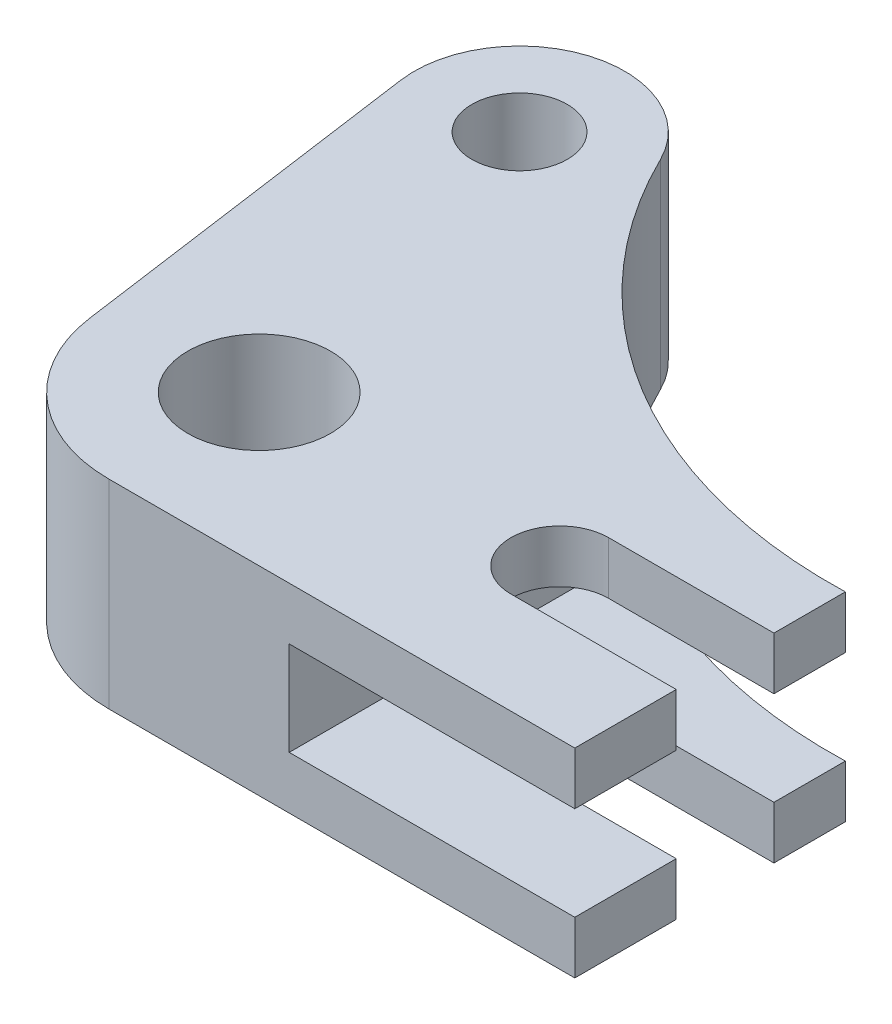
ISO-10303-21;
HEADER;
FILE_DESCRIPTION(('STEP AP214'),'2;1');
FILE_NAME('part.step','',(''),(''),'','','');
FILE_SCHEMA(('AUTOMOTIVE_DESIGN { 1 0 10303 214 1 1 1 1 }'));
ENDSEC;
DATA;
#1=APPLICATION_CONTEXT('core data for automotive mechanical design processes');
#2=APPLICATION_PROTOCOL_DEFINITION('international standard','automotive_design',2000,#1);
#3=PRODUCT_CONTEXT('',#1,'mechanical');
#4=PRODUCT('Part','Part','',(#3));
#5=PRODUCT_RELATED_PRODUCT_CATEGORY('part','',(#4));
#6=PRODUCT_DEFINITION_FORMATION('','',#4);
#7=PRODUCT_DEFINITION_CONTEXT('part definition',#1,'design');
#8=PRODUCT_DEFINITION('design','',#6,#7);
#9=PRODUCT_DEFINITION_SHAPE('','',#8);
#10=(LENGTH_UNIT() NAMED_UNIT(*) SI_UNIT(.MILLI.,.METRE.));
#11=(NAMED_UNIT(*) PLANE_ANGLE_UNIT() SI_UNIT($,.RADIAN.));
#12=(NAMED_UNIT(*) SI_UNIT($,.STERADIAN.) SOLID_ANGLE_UNIT());
#13=UNCERTAINTY_MEASURE_WITH_UNIT(LENGTH_MEASURE(1.E-05),#10,'distance_accuracy_value','');
#14=(GEOMETRIC_REPRESENTATION_CONTEXT(3) GLOBAL_UNCERTAINTY_ASSIGNED_CONTEXT((#13)) GLOBAL_UNIT_ASSIGNED_CONTEXT((#10,
#11,#12)) REPRESENTATION_CONTEXT('',''));
#15=CARTESIAN_POINT('',(0.,0.,0.));
#16=DIRECTION('',(0.,0.,1.));
#17=DIRECTION('',(1.,0.,0.));
#18=AXIS2_PLACEMENT_3D('',#15,#16,#17);
#19=CARTESIAN_POINT('',(-1.94499816987299,13.25,-102.971762572887));
#20=DIRECTION('',(0.,-1.,0.));
#21=DIRECTION('',(0.,0.,-1.));
#22=AXIS2_PLACEMENT_3D('',#19,#20,#21);
#23=CYLINDRICAL_SURFACE('',#22,67.);
#24=DIRECTION('',(0.,-1.,0.));
#25=VECTOR('',#24,1.);
#26=CARTESIAN_POINT('',(0.,13.25,-36.));
#27=LINE('',#26,#25);
#28=CARTESIAN_POINT('',(0.,13.25,-36.));
#29=VERTEX_POINT('',#28);
#30=CARTESIAN_POINT('',(0.,6.25,-36.));
#31=VERTEX_POINT('',#30);
#32=EDGE_CURVE('E233',#29,#31,#27,.T.);
#33=ORIENTED_EDGE('',*,*,#32,.T.);
#34=CARTESIAN_POINT('',(-1.94499816987299,6.25,-102.971762572887));
#35=DIRECTION('',(0.,-1.,0.));
#36=DIRECTION('',(0.,0.,-1.));
#37=AXIS2_PLACEMENT_3D('',#34,#35,#36);
#38=CIRCLE('',#37,67.);
#39=CARTESIAN_POINT('',(-38.,6.25,-46.50020474924));
#40=VERTEX_POINT('',#39);
#41=EDGE_CURVE('E423',#31,#40,#38,.T.);
#42=ORIENTED_EDGE('',*,*,#41,.T.);
#43=DIRECTION('',(0.,-1.,0.));
#44=VECTOR('',#43,1.);
#45=CARTESIAN_POINT('',(-38.,13.25,-46.50020474924));
#46=LINE('',#45,#44);
#47=CARTESIAN_POINT('',(-38.,-6.25,-46.50020474924));
#48=VERTEX_POINT('',#47);
#49=EDGE_CURVE('E191',#48,#40,#46,.F.);
#50=ORIENTED_EDGE('',*,*,#49,.F.);
#51=CARTESIAN_POINT('',(-1.94499816987299,-6.25,-102.971762572887));
#52=DIRECTION('',(0.,1.,0.));
#53=DIRECTION('',(0.,0.,1.));
#54=AXIS2_PLACEMENT_3D('',#51,#52,#53);
#55=CIRCLE('',#54,67.);
#56=CARTESIAN_POINT('',(0.,-6.25,-36.));
#57=VERTEX_POINT('',#56);
#58=EDGE_CURVE('E271',#48,#57,#55,.T.);
#59=ORIENTED_EDGE('',*,*,#58,.T.);
#60=CARTESIAN_POINT('',(0.,-13.25,-36.));
#61=VERTEX_POINT('',#60);
#62=EDGE_CURVE('E110',#57,#61,#27,.T.);
#63=ORIENTED_EDGE('',*,*,#62,.T.);
#64=CARTESIAN_POINT('',(-1.94499816987299,-13.25,-102.971762572887));
#65=DIRECTION('',(0.,1.,0.));
#66=DIRECTION('',(0.,0.,1.));
#67=AXIS2_PLACEMENT_3D('',#64,#65,#66);
#68=CIRCLE('',#67,67.);
#69=CARTESIAN_POINT('',(-62.1102827092568,-13.25,-73.4906069595979));
#70=VERTEX_POINT('',#69);
#71=EDGE_CURVE('E186',#70,#61,#68,.T.);
#72=ORIENTED_EDGE('',*,*,#71,.F.);
#73=DIRECTION('',(0.,-1.,0.));
#74=VECTOR('',#73,1.);
#75=CARTESIAN_POINT('',(-62.1102827092568,13.25,-73.4906069595979));
#76=LINE('',#75,#74);
#77=CARTESIAN_POINT('',(-62.1102827092568,13.25,-73.4906069595979));
#78=VERTEX_POINT('',#77);
#79=EDGE_CURVE('E116',#78,#70,#76,.T.);
#80=ORIENTED_EDGE('',*,*,#79,.F.);
#81=CARTESIAN_POINT('',(-1.94499816987299,13.25,-102.971762572887));
#82=DIRECTION('',(0.,1.,0.));
#83=DIRECTION('',(0.,0.,1.));
#84=AXIS2_PLACEMENT_3D('',#81,#82,#83);
#85=CIRCLE('',#84,67.);
#86=EDGE_CURVE('E232',#78,#29,#85,.T.);
#87=ORIENTED_EDGE('',*,*,#86,.T.);
#88=EDGE_LOOP('',(#33,#42,#50,#59,#63,#72,#80,#87));
#89=FACE_BOUND('',#88,.T.);
#90=ADVANCED_FACE('F46',(#89),#23,.F.);
#91=CARTESIAN_POINT('',(0.,13.25,0.));
#92=DIRECTION('',(0.,0.,1.));
#93=DIRECTION('',(1.,0.,0.));
#94=AXIS2_PLACEMENT_3D('',#91,#92,#93);
#95=PLANE('',#94);
#96=DIRECTION('',(0.,1.,0.));
#97=VECTOR('',#96,1.);
#98=CARTESIAN_POINT('',(-38.,-6.25,0.));
#99=LINE('',#98,#97);
#100=CARTESIAN_POINT('',(-38.,-6.25,0.));
#101=VERTEX_POINT('',#100);
#102=CARTESIAN_POINT('',(-38.,6.25,0.));
#103=VERTEX_POINT('',#102);
#104=EDGE_CURVE('E388',#101,#103,#99,.T.);
#105=ORIENTED_EDGE('',*,*,#104,.T.);
#106=DIRECTION('',(1.,0.,0.));
#107=VECTOR('',#106,1.);
#108=CARTESIAN_POINT('',(-38.,6.25,0.));
#109=LINE('',#108,#107);
#110=CARTESIAN_POINT('',(0.,6.25,0.));
#111=VERTEX_POINT('',#110);
#112=EDGE_CURVE('E393',#103,#111,#109,.T.);
#113=ORIENTED_EDGE('',*,*,#112,.T.);
#114=DIRECTION('',(0.,-1.,0.));
#115=VECTOR('',#114,1.);
#116=CARTESIAN_POINT('',(0.,13.25,0.));
#117=LINE('',#116,#115);
#118=CARTESIAN_POINT('',(0.,13.25,0.));
#119=VERTEX_POINT('',#118);
#120=EDGE_CURVE('E249',#119,#111,#117,.T.);
#121=ORIENTED_EDGE('',*,*,#120,.F.);
#122=DIRECTION('',(-1.,0.,0.));
#123=VECTOR('',#122,1.);
#124=CARTESIAN_POINT('',(0.,13.25,0.));
#125=LINE('',#124,#123);
#126=CARTESIAN_POINT('',(-62.,13.25,0.));
#127=VERTEX_POINT('',#126);
#128=EDGE_CURVE('E315',#119,#127,#125,.T.);
#129=ORIENTED_EDGE('',*,*,#128,.T.);
#130=DIRECTION('',(0.,-1.,0.));
#131=VECTOR('',#130,1.);
#132=CARTESIAN_POINT('',(-62.,13.25,0.));
#133=LINE('',#132,#131);
#134=CARTESIAN_POINT('',(-62.,-13.25,0.));
#135=VERTEX_POINT('',#134);
#136=EDGE_CURVE('E253',#127,#135,#133,.T.);
#137=ORIENTED_EDGE('',*,*,#136,.T.);
#138=DIRECTION('',(-1.,0.,0.));
#139=VECTOR('',#138,1.);
#140=CARTESIAN_POINT('',(0.,-13.25,0.));
#141=LINE('',#140,#139);
#142=CARTESIAN_POINT('',(0.,-13.25,0.));
#143=VERTEX_POINT('',#142);
#144=EDGE_CURVE('E201',#143,#135,#141,.T.);
#145=ORIENTED_EDGE('',*,*,#144,.F.);
#146=CARTESIAN_POINT('',(0.,-6.25,0.));
#147=VERTEX_POINT('',#146);
#148=EDGE_CURVE('E248',#147,#143,#117,.T.);
#149=ORIENTED_EDGE('',*,*,#148,.F.);
#150=DIRECTION('',(1.,0.,0.));
#151=VECTOR('',#150,1.);
#152=CARTESIAN_POINT('',(-38.,-6.25,0.));
#153=LINE('',#152,#151);
#154=EDGE_CURVE('E396',#101,#147,#153,.T.);
#155=ORIENTED_EDGE('',*,*,#154,.F.);
#156=EDGE_LOOP('',(#105,#113,#121,#129,#137,#145,#149,#155));
#157=FACE_BOUND('',#156,.T.);
#158=ADVANCED_FACE('F311',(#157),#95,.T.);
#159=CARTESIAN_POINT('',(0.,13.25,0.));
#160=DIRECTION('',(-1.,0.,0.));
#161=DIRECTION('',(0.,0.,1.));
#162=AXIS2_PLACEMENT_3D('',#159,#160,#161);
#163=PLANE('',#162);
#164=DIRECTION('',(0.,0.,-1.));
#165=VECTOR('',#164,1.);
#166=CARTESIAN_POINT('',(0.,6.25,0.));
#167=LINE('',#166,#165);
#168=CARTESIAN_POINT('',(0.,6.25,-13.5));
#169=VERTEX_POINT('',#168);
#170=EDGE_CURVE('E351',#111,#169,#167,.T.);
#171=ORIENTED_EDGE('',*,*,#170,.T.);
#172=DIRECTION('',(0.,-1.,0.));
#173=VECTOR('',#172,1.);
#174=CARTESIAN_POINT('',(0.,13.25,-13.5));
#175=LINE('',#174,#173);
#176=CARTESIAN_POINT('',(0.,13.25,-13.5));
#177=VERTEX_POINT('',#176);
#178=EDGE_CURVE('E244',#177,#169,#175,.T.);
#179=ORIENTED_EDGE('',*,*,#178,.F.);
#180=DIRECTION('',(0.,0.,-1.));
#181=VECTOR('',#180,1.);
#182=CARTESIAN_POINT('',(0.,13.25,0.));
#183=LINE('',#182,#181);
#184=EDGE_CURVE('E172',#119,#177,#183,.T.);
#185=ORIENTED_EDGE('',*,*,#184,.F.);
#186=ORIENTED_EDGE('',*,*,#120,.T.);
#187=EDGE_LOOP('',(#171,#179,#185,#186));
#188=FACE_BOUND('',#187,.T.);
#189=ADVANCED_FACE('F348',(#188),#163,.F.);
#190=DIRECTION('',(0.,0.,1.));
#191=VECTOR('',#190,1.);
#192=CARTESIAN_POINT('',(0.,-6.25,-73.3389449580955));
#193=LINE('',#192,#191);
#194=CARTESIAN_POINT('',(0.,-6.25,-13.5));
#195=VERTEX_POINT('',#194);
#196=EDGE_CURVE('E301',#195,#147,#193,.T.);
#197=ORIENTED_EDGE('',*,*,#196,.T.);
#198=ORIENTED_EDGE('',*,*,#148,.T.);
#199=DIRECTION('',(0.,0.,-1.));
#200=VECTOR('',#199,1.);
#201=CARTESIAN_POINT('',(0.,-13.25,0.));
#202=LINE('',#201,#200);
#203=CARTESIAN_POINT('',(0.,-13.25,-13.5));
#204=VERTEX_POINT('',#203);
#205=EDGE_CURVE('E205',#143,#204,#202,.T.);
#206=ORIENTED_EDGE('',*,*,#205,.T.);
#207=EDGE_CURVE('E243',#195,#204,#175,.T.);
#208=ORIENTED_EDGE('',*,*,#207,.F.);
#209=EDGE_LOOP('',(#197,#198,#206,#208));
#210=FACE_BOUND('',#209,.T.);
#211=ADVANCED_FACE('F297',(#210),#163,.F.);
#212=CARTESIAN_POINT('',(0.,13.25,-13.5));
#213=DIRECTION('',(0.,0.,-1.));
#214=DIRECTION('',(-1.,0.,0.));
#215=AXIS2_PLACEMENT_3D('',#212,#213,#214);
#216=PLANE('',#215);
#217=ORIENTED_EDGE('',*,*,#178,.T.);
#218=DIRECTION('',(-1.,0.,0.));
#219=VECTOR('',#218,1.);
#220=CARTESIAN_POINT('',(0.,6.25,-13.5));
#221=LINE('',#220,#219);
#222=CARTESIAN_POINT('',(-22.,6.25,-13.5));
#223=VERTEX_POINT('',#222);
#224=EDGE_CURVE('E356',#169,#223,#221,.T.);
#225=ORIENTED_EDGE('',*,*,#224,.T.);
#226=DIRECTION('',(0.,-1.,0.));
#227=VECTOR('',#226,1.);
#228=CARTESIAN_POINT('',(-22.,13.25,-13.5));
#229=LINE('',#228,#227);
#230=CARTESIAN_POINT('',(-22.,13.25,-13.5));
#231=VERTEX_POINT('',#230);
#232=EDGE_CURVE('E240',#231,#223,#229,.T.);
#233=ORIENTED_EDGE('',*,*,#232,.F.);
#234=DIRECTION('',(1.,0.,0.));
#235=VECTOR('',#234,1.);
#236=CARTESIAN_POINT('',(0.,13.25,-13.5));
#237=LINE('',#236,#235);
#238=EDGE_CURVE('E168',#231,#177,#237,.T.);
#239=ORIENTED_EDGE('',*,*,#238,.T.);
#240=EDGE_LOOP('',(#217,#225,#233,#239));
#241=FACE_BOUND('',#240,.T.);
#242=ADVANCED_FACE('F354',(#241),#216,.T.);
#243=CARTESIAN_POINT('',(-22.,-6.25,-13.5));
#244=VERTEX_POINT('',#243);
#245=CARTESIAN_POINT('',(-22.,-13.25,-13.5));
#246=VERTEX_POINT('',#245);
#247=EDGE_CURVE('E154',#244,#246,#229,.T.);
#248=ORIENTED_EDGE('',*,*,#247,.F.);
#249=DIRECTION('',(1.,0.,0.));
#250=VECTOR('',#249,1.);
#251=CARTESIAN_POINT('',(0.,-6.25,-13.5));
#252=LINE('',#251,#250);
#253=EDGE_CURVE('E283',#244,#195,#252,.T.);
#254=ORIENTED_EDGE('',*,*,#253,.T.);
#255=ORIENTED_EDGE('',*,*,#207,.T.);
#256=DIRECTION('',(1.,0.,0.));
#257=VECTOR('',#256,1.);
#258=CARTESIAN_POINT('',(0.,-13.25,-13.5));
#259=LINE('',#258,#257);
#260=EDGE_CURVE('E209',#246,#204,#259,.T.);
#261=ORIENTED_EDGE('',*,*,#260,.F.);
#262=EDGE_LOOP('',(#248,#254,#255,#261));
#263=FACE_BOUND('',#262,.T.);
#264=ADVANCED_FACE('F536',(#263),#216,.T.);
#265=CARTESIAN_POINT('',(-22.,13.25,-20.));
#266=DIRECTION('',(0.,-1.,0.));
#267=DIRECTION('',(0.,0.,-1.));
#268=AXIS2_PLACEMENT_3D('',#265,#266,#267);
#269=CYLINDRICAL_SURFACE('',#268,6.5);
#270=ORIENTED_EDGE('',*,*,#232,.T.);
#271=CARTESIAN_POINT('',(-22.,6.25,-20.));
#272=DIRECTION('',(0.,-1.,0.));
#273=DIRECTION('',(0.,0.,-1.));
#274=AXIS2_PLACEMENT_3D('',#271,#272,#273);
#275=CIRCLE('',#274,6.5);
#276=CARTESIAN_POINT('',(-22.,6.25,-26.5));
#277=VERTEX_POINT('',#276);
#278=EDGE_CURVE('E150',#223,#277,#275,.T.);
#279=ORIENTED_EDGE('',*,*,#278,.T.);
#280=DIRECTION('',(0.,-1.,0.));
#281=VECTOR('',#280,1.);
#282=CARTESIAN_POINT('',(-22.,13.25,-26.5));
#283=LINE('',#282,#281);
#284=CARTESIAN_POINT('',(-22.,13.25,-26.5));
#285=VERTEX_POINT('',#284);
#286=EDGE_CURVE('E142',#285,#277,#283,.T.);
#287=ORIENTED_EDGE('',*,*,#286,.F.);
#288=CARTESIAN_POINT('',(-22.,13.25,-20.));
#289=DIRECTION('',(0.,1.,0.));
#290=DIRECTION('',(0.,0.,1.));
#291=AXIS2_PLACEMENT_3D('',#288,#289,#290);
#292=CIRCLE('',#291,6.5);
#293=EDGE_CURVE('E147',#285,#231,#292,.T.);
#294=ORIENTED_EDGE('',*,*,#293,.T.);
#295=EDGE_LOOP('',(#270,#279,#287,#294));
#296=FACE_BOUND('',#295,.T.);
#297=ADVANCED_FACE('F145',(#296),#269,.F.);
#298=CARTESIAN_POINT('',(-22.,-6.25,-26.5));
#299=VERTEX_POINT('',#298);
#300=CARTESIAN_POINT('',(-22.,-13.25,-26.5));
#301=VERTEX_POINT('',#300);
#302=EDGE_CURVE('E155',#299,#301,#283,.T.);
#303=ORIENTED_EDGE('',*,*,#302,.F.);
#304=CARTESIAN_POINT('',(-22.,-6.25,-20.));
#305=DIRECTION('',(0.,1.,0.));
#306=DIRECTION('',(0.,0.,1.));
#307=AXIS2_PLACEMENT_3D('',#304,#305,#306);
#308=CIRCLE('',#307,6.5);
#309=EDGE_CURVE('E411',#299,#244,#308,.T.);
#310=ORIENTED_EDGE('',*,*,#309,.T.);
#311=ORIENTED_EDGE('',*,*,#247,.T.);
#312=CARTESIAN_POINT('',(-22.,-13.25,-20.));
#313=DIRECTION('',(0.,1.,0.));
#314=DIRECTION('',(0.,0.,1.));
#315=AXIS2_PLACEMENT_3D('',#312,#313,#314);
#316=CIRCLE('',#315,6.5);
#317=EDGE_CURVE('E213',#301,#246,#316,.T.);
#318=ORIENTED_EDGE('',*,*,#317,.F.);
#319=EDGE_LOOP('',(#303,#310,#311,#318));
#320=FACE_BOUND('',#319,.T.);
#321=ADVANCED_FACE('F521',(#320),#269,.F.);
#322=CARTESIAN_POINT('',(0.,13.25,-26.5));
#323=DIRECTION('',(0.,0.,-1.));
#324=DIRECTION('',(-1.,0.,0.));
#325=AXIS2_PLACEMENT_3D('',#322,#323,#324);
#326=PLANE('',#325);
#327=DIRECTION('',(-1.,0.,0.));
#328=VECTOR('',#327,1.);
#329=CARTESIAN_POINT('',(0.,6.25,-26.5));
#330=LINE('',#329,#328);
#331=CARTESIAN_POINT('',(0.,6.25,-26.5));
#332=VERTEX_POINT('',#331);
#333=EDGE_CURVE('E282',#332,#277,#330,.T.);
#334=ORIENTED_EDGE('',*,*,#333,.F.);
#335=DIRECTION('',(0.,-1.,0.));
#336=VECTOR('',#335,1.);
#337=CARTESIAN_POINT('',(0.,13.25,-26.5));
#338=LINE('',#337,#336);
#339=CARTESIAN_POINT('',(0.,13.25,-26.5));
#340=VERTEX_POINT('',#339);
#341=EDGE_CURVE('E161',#340,#332,#338,.T.);
#342=ORIENTED_EDGE('',*,*,#341,.F.);
#343=DIRECTION('',(1.,0.,0.));
#344=VECTOR('',#343,1.);
#345=CARTESIAN_POINT('',(0.,13.25,-26.5));
#346=LINE('',#345,#344);
#347=EDGE_CURVE('E158',#285,#340,#346,.T.);
#348=ORIENTED_EDGE('',*,*,#347,.F.);
#349=ORIENTED_EDGE('',*,*,#286,.T.);
#350=EDGE_LOOP('',(#334,#342,#348,#349));
#351=FACE_BOUND('',#350,.T.);
#352=ADVANCED_FACE('F159',(#351),#326,.F.);
#353=DIRECTION('',(1.,0.,0.));
#354=VECTOR('',#353,1.);
#355=CARTESIAN_POINT('',(0.,-6.25,-26.5));
#356=LINE('',#355,#354);
#357=CARTESIAN_POINT('',(0.,-6.25,-26.5));
#358=VERTEX_POINT('',#357);
#359=EDGE_CURVE('E61',#299,#358,#356,.T.);
#360=ORIENTED_EDGE('',*,*,#359,.F.);
#361=ORIENTED_EDGE('',*,*,#302,.T.);
#362=DIRECTION('',(1.,0.,0.));
#363=VECTOR('',#362,1.);
#364=CARTESIAN_POINT('',(0.,-13.25,-26.5));
#365=LINE('',#364,#363);
#366=CARTESIAN_POINT('',(0.,-13.25,-26.5));
#367=VERTEX_POINT('',#366);
#368=EDGE_CURVE('E217',#301,#367,#365,.T.);
#369=ORIENTED_EDGE('',*,*,#368,.T.);
#370=EDGE_CURVE('E237',#358,#367,#338,.T.);
#371=ORIENTED_EDGE('',*,*,#370,.F.);
#372=EDGE_LOOP('',(#360,#361,#369,#371));
#373=FACE_BOUND('',#372,.T.);
#374=ADVANCED_FACE('F430',(#373),#326,.F.);
#375=CARTESIAN_POINT('',(0.,13.25,0.));
#376=DIRECTION('',(-1.,0.,0.));
#377=DIRECTION('',(0.,0.,1.));
#378=AXIS2_PLACEMENT_3D('',#375,#376,#377);
#379=PLANE('',#378);
#380=DIRECTION('',(0.,0.,1.));
#381=VECTOR('',#380,1.);
#382=CARTESIAN_POINT('',(0.,6.25,0.));
#383=LINE('',#382,#381);
#384=EDGE_CURVE('E11',#31,#332,#383,.T.);
#385=ORIENTED_EDGE('',*,*,#384,.F.);
#386=ORIENTED_EDGE('',*,*,#32,.F.);
#387=DIRECTION('',(0.,0.,-1.));
#388=VECTOR('',#387,1.);
#389=CARTESIAN_POINT('',(0.,13.25,0.));
#390=LINE('',#389,#388);
#391=EDGE_CURVE('E70',#340,#29,#390,.T.);
#392=ORIENTED_EDGE('',*,*,#391,.F.);
#393=ORIENTED_EDGE('',*,*,#341,.T.);
#394=EDGE_LOOP('',(#385,#386,#392,#393));
#395=FACE_BOUND('',#394,.T.);
#396=ADVANCED_FACE('F428',(#395),#379,.F.);
#397=DIRECTION('',(0.,0.,-1.));
#398=VECTOR('',#397,1.);
#399=CARTESIAN_POINT('',(0.,-6.25,0.));
#400=LINE('',#399,#398);
#401=EDGE_CURVE('E54',#358,#57,#400,.T.);
#402=ORIENTED_EDGE('',*,*,#401,.F.);
#403=ORIENTED_EDGE('',*,*,#370,.T.);
#404=DIRECTION('',(0.,0.,-1.));
#405=VECTOR('',#404,1.);
#406=CARTESIAN_POINT('',(0.,-13.25,0.));
#407=LINE('',#406,#405);
#408=EDGE_CURVE('E221',#367,#61,#407,.T.);
#409=ORIENTED_EDGE('',*,*,#408,.T.);
#410=ORIENTED_EDGE('',*,*,#62,.F.);
#411=EDGE_LOOP('',(#402,#403,#409,#410));
#412=FACE_BOUND('',#411,.T.);
#413=ADVANCED_FACE('F285',(#412),#379,.F.);
#414=CARTESIAN_POINT('',(-74.6821332100236,13.25,-67.3303654881643));
#415=DIRECTION('',(0.,-1.,0.));
#416=DIRECTION('',(0.,0.,-1.));
#417=AXIS2_PLACEMENT_3D('',#414,#415,#416);
#418=CYLINDRICAL_SURFACE('',#417,14.);
#419=CARTESIAN_POINT('',(-74.6821332100236,-13.25,-67.3303654881643));
#420=DIRECTION('',(0.,1.,0.));
#421=DIRECTION('',(0.,0.,1.));
#422=AXIS2_PLACEMENT_3D('',#419,#420,#421);
#423=CIRCLE('',#422,14.);
#424=CARTESIAN_POINT('',(-88.5470217071029,-13.25,-65.3900389786416));
#425=VERTEX_POINT('',#424);
#426=EDGE_CURVE('E190',#70,#425,#423,.T.);
#427=ORIENTED_EDGE('',*,*,#426,.T.);
#428=DIRECTION('',(0.,-1.,0.));
#429=VECTOR('',#428,1.);
#430=CARTESIAN_POINT('',(-88.5470217071029,13.25,-65.3900389786416));
#431=LINE('',#430,#429);
#432=CARTESIAN_POINT('',(-88.5470217071029,13.25,-65.3900389786416));
#433=VERTEX_POINT('',#432);
#434=EDGE_CURVE('E260',#433,#425,#431,.T.);
#435=ORIENTED_EDGE('',*,*,#434,.F.);
#436=CARTESIAN_POINT('',(-74.6821332100236,13.25,-67.3303654881643));
#437=DIRECTION('',(0.,1.,0.));
#438=DIRECTION('',(0.,0.,1.));
#439=AXIS2_PLACEMENT_3D('',#436,#437,#438);
#440=CIRCLE('',#439,14.);
#441=EDGE_CURVE('E329',#78,#433,#440,.T.);
#442=ORIENTED_EDGE('',*,*,#441,.F.);
#443=ORIENTED_EDGE('',*,*,#79,.T.);
#444=EDGE_LOOP('',(#427,#435,#442,#443));
#445=FACE_BOUND('',#444,.T.);
#446=ADVANCED_FACE('F328',(#445),#418,.T.);
#447=CARTESIAN_POINT('',(-77.8709123132272,13.25,10.8976711578965));
#448=DIRECTION('',(0.990349178362811,0.,-0.138594750680193));
#449=DIRECTION('',(-0.138594750680193,0.,-0.990349178362811));
#450=AXIS2_PLACEMENT_3D('',#447,#448,#449);
#451=PLANE('',#450);
#452=DIRECTION('',(0.138594750680193,0.,0.990349178362811));
#453=VECTOR('',#452,1.);
#454=CARTESIAN_POINT('',(-77.8709123132272,-13.25,10.8976711578965));
#455=LINE('',#454,#453);
#456=CARTESIAN_POINT('',(-81.8069835672562,-13.25,-17.2281049863961));
#457=VERTEX_POINT('',#456);
#458=EDGE_CURVE('E194',#425,#457,#455,.T.);
#459=ORIENTED_EDGE('',*,*,#458,.T.);
#460=DIRECTION('',(0.,-1.,0.));
#461=VECTOR('',#460,1.);
#462=CARTESIAN_POINT('',(-81.8069835672562,13.25,-17.2281049863961));
#463=LINE('',#462,#461);
#464=CARTESIAN_POINT('',(-81.8069835672562,13.25,-17.2281049863961));
#465=VERTEX_POINT('',#464);
#466=EDGE_CURVE('E256',#465,#457,#463,.T.);
#467=ORIENTED_EDGE('',*,*,#466,.F.);
#468=DIRECTION('',(0.138594750680193,0.,0.990349178362811));
#469=VECTOR('',#468,1.);
#470=CARTESIAN_POINT('',(-77.8709123132272,13.25,10.8976711578965));
#471=LINE('',#470,#469);
#472=EDGE_CURVE('E326',#433,#465,#471,.T.);
#473=ORIENTED_EDGE('',*,*,#472,.F.);
#474=ORIENTED_EDGE('',*,*,#434,.T.);
#475=EDGE_LOOP('',(#459,#467,#473,#474));
#476=FACE_BOUND('',#475,.T.);
#477=ADVANCED_FACE('F323',(#476),#451,.F.);
#478=CARTESIAN_POINT('',(-62.,13.25,-20.));
#479=DIRECTION('',(0.,-1.,0.));
#480=DIRECTION('',(0.,0.,-1.));
#481=AXIS2_PLACEMENT_3D('',#478,#479,#480);
#482=CYLINDRICAL_SURFACE('',#481,20.);
#483=CARTESIAN_POINT('',(-62.,-13.25,-20.));
#484=DIRECTION('',(0.,1.,0.));
#485=DIRECTION('',(0.,0.,1.));
#486=AXIS2_PLACEMENT_3D('',#483,#484,#485);
#487=CIRCLE('',#486,20.);
#488=EDGE_CURVE('E197',#457,#135,#487,.T.);
#489=ORIENTED_EDGE('',*,*,#488,.T.);
#490=ORIENTED_EDGE('',*,*,#136,.F.);
#491=CARTESIAN_POINT('',(-62.,13.25,-20.));
#492=DIRECTION('',(0.,1.,0.));
#493=DIRECTION('',(0.,0.,1.));
#494=AXIS2_PLACEMENT_3D('',#491,#492,#493);
#495=CIRCLE('',#494,20.);
#496=EDGE_CURVE('E339',#465,#127,#495,.T.);
#497=ORIENTED_EDGE('',*,*,#496,.F.);
#498=ORIENTED_EDGE('',*,*,#466,.T.);
#499=EDGE_LOOP('',(#489,#490,#497,#498));
#500=FACE_BOUND('',#499,.T.);
#501=ADVANCED_FACE('F318',(#500),#482,.T.);
#502=CARTESIAN_POINT('',(-74.6821332100236,13.25,-67.3303654881643));
#503=DIRECTION('',(0.,-1.,0.));
#504=DIRECTION('',(0.,0.,-1.));
#505=AXIS2_PLACEMENT_3D('',#502,#503,#504);
#506=CYLINDRICAL_SURFACE('',#505,6.34999999999999);
#507=CARTESIAN_POINT('',(-74.6821332100236,13.25,-67.3303654881643));
#508=DIRECTION('',(0.,1.,0.));
#509=DIRECTION('',(0.,0.,1.));
#510=AXIS2_PLACEMENT_3D('',#507,#508,#509);
#511=CIRCLE('',#510,6.34999999999999);
#512=CARTESIAN_POINT('',(-74.6821332100236,13.25,-60.9803654881643));
#513=VERTEX_POINT('',#512);
#514=EDGE_CURVE('E178',#513,#513,#511,.T.);
#515=ORIENTED_EDGE('',*,*,#514,.T.);
#516=EDGE_LOOP('',(#515));
#517=FACE_BOUND('',#516,.T.);
#518=CARTESIAN_POINT('',(-74.6821332100236,-13.25,-67.3303654881643));
#519=DIRECTION('',(0.,1.,0.));
#520=DIRECTION('',(0.,0.,1.));
#521=AXIS2_PLACEMENT_3D('',#518,#519,#520);
#522=CIRCLE('',#521,6.34999999999999);
#523=CARTESIAN_POINT('',(-74.6821332100236,-13.25,-60.9803654881643));
#524=VERTEX_POINT('',#523);
#525=EDGE_CURVE('E224',#524,#524,#522,.T.);
#526=ORIENTED_EDGE('',*,*,#525,.F.);
#527=EDGE_LOOP('',(#526));
#528=FACE_BOUND('',#527,.T.);
#529=ADVANCED_FACE('F453',(#517,#528),#506,.F.);
#530=CARTESIAN_POINT('',(-62.,13.25,-20.));
#531=DIRECTION('',(0.,-1.,0.));
#532=DIRECTION('',(0.,0.,-1.));
#533=AXIS2_PLACEMENT_3D('',#530,#531,#532);
#534=CYLINDRICAL_SURFACE('',#533,9.5);
#535=CARTESIAN_POINT('',(-62.,13.25,-20.));
#536=DIRECTION('',(0.,1.,0.));
#537=DIRECTION('',(0.,0.,1.));
#538=AXIS2_PLACEMENT_3D('',#535,#536,#537);
#539=CIRCLE('',#538,9.5);
#540=CARTESIAN_POINT('',(-62.,13.25,-10.5));
#541=VERTEX_POINT('',#540);
#542=EDGE_CURVE('E182',#541,#541,#539,.T.);
#543=ORIENTED_EDGE('',*,*,#542,.T.);
#544=EDGE_LOOP('',(#543));
#545=FACE_BOUND('',#544,.T.);
#546=CARTESIAN_POINT('',(-62.,-13.25,-20.));
#547=DIRECTION('',(0.,1.,0.));
#548=DIRECTION('',(0.,0.,1.));
#549=AXIS2_PLACEMENT_3D('',#546,#547,#548);
#550=CIRCLE('',#549,9.5);
#551=CARTESIAN_POINT('',(-62.,-13.25,-10.5));
#552=VERTEX_POINT('',#551);
#553=EDGE_CURVE('E228',#552,#552,#550,.T.);
#554=ORIENTED_EDGE('',*,*,#553,.F.);
#555=EDGE_LOOP('',(#554));
#556=FACE_BOUND('',#555,.T.);
#557=ADVANCED_FACE('F475',(#545,#556),#534,.F.);
#558=CARTESIAN_POINT('',(0.,13.25,0.));
#559=DIRECTION('',(0.,1.,0.));
#560=DIRECTION('',(0.,0.,1.));
#561=AXIS2_PLACEMENT_3D('',#558,#559,#560);
#562=PLANE('',#561);
#563=ORIENTED_EDGE('',*,*,#86,.F.);
#564=ORIENTED_EDGE('',*,*,#441,.T.);
#565=ORIENTED_EDGE('',*,*,#472,.T.);
#566=ORIENTED_EDGE('',*,*,#496,.T.);
#567=ORIENTED_EDGE('',*,*,#128,.F.);
#568=ORIENTED_EDGE('',*,*,#184,.T.);
#569=ORIENTED_EDGE('',*,*,#238,.F.);
#570=ORIENTED_EDGE('',*,*,#293,.F.);
#571=ORIENTED_EDGE('',*,*,#347,.T.);
#572=ORIENTED_EDGE('',*,*,#391,.T.);
#573=EDGE_LOOP('',(#563,#564,#565,#566,#567,#568,#569,#570,#571,#572));
#574=FACE_BOUND('',#573,.T.);
#575=ORIENTED_EDGE('',*,*,#514,.F.);
#576=EDGE_LOOP('',(#575));
#577=FACE_BOUND('',#576,.T.);
#578=ORIENTED_EDGE('',*,*,#542,.F.);
#579=EDGE_LOOP('',(#578));
#580=FACE_BOUND('',#579,.T.);
#581=ADVANCED_FACE('F165',(#574,#577,#580),#562,.T.);
#582=CARTESIAN_POINT('',(0.,-13.25,0.));
#583=DIRECTION('',(0.,1.,0.));
#584=DIRECTION('',(0.,0.,1.));
#585=AXIS2_PLACEMENT_3D('',#582,#583,#584);
#586=PLANE('',#585);
#587=ORIENTED_EDGE('',*,*,#71,.T.);
#588=ORIENTED_EDGE('',*,*,#408,.F.);
#589=ORIENTED_EDGE('',*,*,#368,.F.);
#590=ORIENTED_EDGE('',*,*,#317,.T.);
#591=ORIENTED_EDGE('',*,*,#260,.T.);
#592=ORIENTED_EDGE('',*,*,#205,.F.);
#593=ORIENTED_EDGE('',*,*,#144,.T.);
#594=ORIENTED_EDGE('',*,*,#488,.F.);
#595=ORIENTED_EDGE('',*,*,#458,.F.);
#596=ORIENTED_EDGE('',*,*,#426,.F.);
#597=EDGE_LOOP('',(#587,#588,#589,#590,#591,#592,#593,#594,#595,#596));
#598=FACE_BOUND('',#597,.T.);
#599=ORIENTED_EDGE('',*,*,#525,.T.);
#600=EDGE_LOOP('',(#599));
#601=FACE_BOUND('',#600,.T.);
#602=ORIENTED_EDGE('',*,*,#553,.T.);
#603=EDGE_LOOP('',(#602));
#604=FACE_BOUND('',#603,.T.);
#605=ADVANCED_FACE('F306',(#598,#601,#604),#586,.F.);
#606=CARTESIAN_POINT('',(-38.,6.25,0.));
#607=DIRECTION('',(0.,-1.,0.));
#608=DIRECTION('',(0.,0.,-1.));
#609=AXIS2_PLACEMENT_3D('',#606,#607,#608);
#610=PLANE('',#609);
#611=ORIENTED_EDGE('',*,*,#384,.T.);
#612=ORIENTED_EDGE('',*,*,#333,.T.);
#613=ORIENTED_EDGE('',*,*,#278,.F.);
#614=ORIENTED_EDGE('',*,*,#224,.F.);
#615=ORIENTED_EDGE('',*,*,#170,.F.);
#616=ORIENTED_EDGE('',*,*,#112,.F.);
#617=DIRECTION('',(0.,0.,-1.));
#618=VECTOR('',#617,1.);
#619=CARTESIAN_POINT('',(-38.,6.25,0.));
#620=LINE('',#619,#618);
#621=EDGE_CURVE('E385',#103,#40,#620,.T.);
#622=ORIENTED_EDGE('',*,*,#621,.T.);
#623=ORIENTED_EDGE('',*,*,#41,.F.);
#624=EDGE_LOOP('',(#611,#612,#613,#614,#615,#616,#622,#623));
#625=FACE_BOUND('',#624,.T.);
#626=ADVANCED_FACE('F394',(#625),#610,.T.);
#627=CARTESIAN_POINT('',(-38.,-6.25,-73.3389449580955));
#628=DIRECTION('',(0.,1.,0.));
#629=DIRECTION('',(0.,0.,1.));
#630=AXIS2_PLACEMENT_3D('',#627,#628,#629);
#631=PLANE('',#630);
#632=DIRECTION('',(0.,0.,1.));
#633=VECTOR('',#632,1.);
#634=CARTESIAN_POINT('',(-38.,-6.25,-73.3389449580955));
#635=LINE('',#634,#633);
#636=EDGE_CURVE('E390',#48,#101,#635,.T.);
#637=ORIENTED_EDGE('',*,*,#636,.T.);
#638=ORIENTED_EDGE('',*,*,#154,.T.);
#639=ORIENTED_EDGE('',*,*,#196,.F.);
#640=ORIENTED_EDGE('',*,*,#253,.F.);
#641=ORIENTED_EDGE('',*,*,#309,.F.);
#642=ORIENTED_EDGE('',*,*,#359,.T.);
#643=ORIENTED_EDGE('',*,*,#401,.T.);
#644=ORIENTED_EDGE('',*,*,#58,.F.);
#645=EDGE_LOOP('',(#637,#638,#639,#640,#641,#642,#643,#644));
#646=FACE_BOUND('',#645,.T.);
#647=ADVANCED_FACE('F269',(#646),#631,.T.);
#648=CARTESIAN_POINT('',(-38.,0.,0.));
#649=DIRECTION('',(-1.,0.,0.));
#650=DIRECTION('',(0.,0.,1.));
#651=AXIS2_PLACEMENT_3D('',#648,#649,#650);
#652=PLANE('',#651);
#653=ORIENTED_EDGE('',*,*,#49,.T.);
#654=ORIENTED_EDGE('',*,*,#621,.F.);
#655=ORIENTED_EDGE('',*,*,#104,.F.);
#656=ORIENTED_EDGE('',*,*,#636,.F.);
#657=EDGE_LOOP('',(#653,#654,#655,#656));
#658=FACE_BOUND('',#657,.T.);
#659=ADVANCED_FACE('F387',(#658),#652,.F.);
#660=CLOSED_SHELL('',(#90,#158,#189,#211,#242,#264,#297,#321,#352,#374,#396,#413,#446,#477,#501,
#529,#557,#581,#605,#626,#647,#659));
#661=MANIFOLD_SOLID_BREP('B2',#660);
#662=ADVANCED_BREP_SHAPE_REPRESENTATION('',(#18,#661),#14);
#663=SHAPE_DEFINITION_REPRESENTATION(#9,#662);
ENDSEC;
END-ISO-10303-21;
